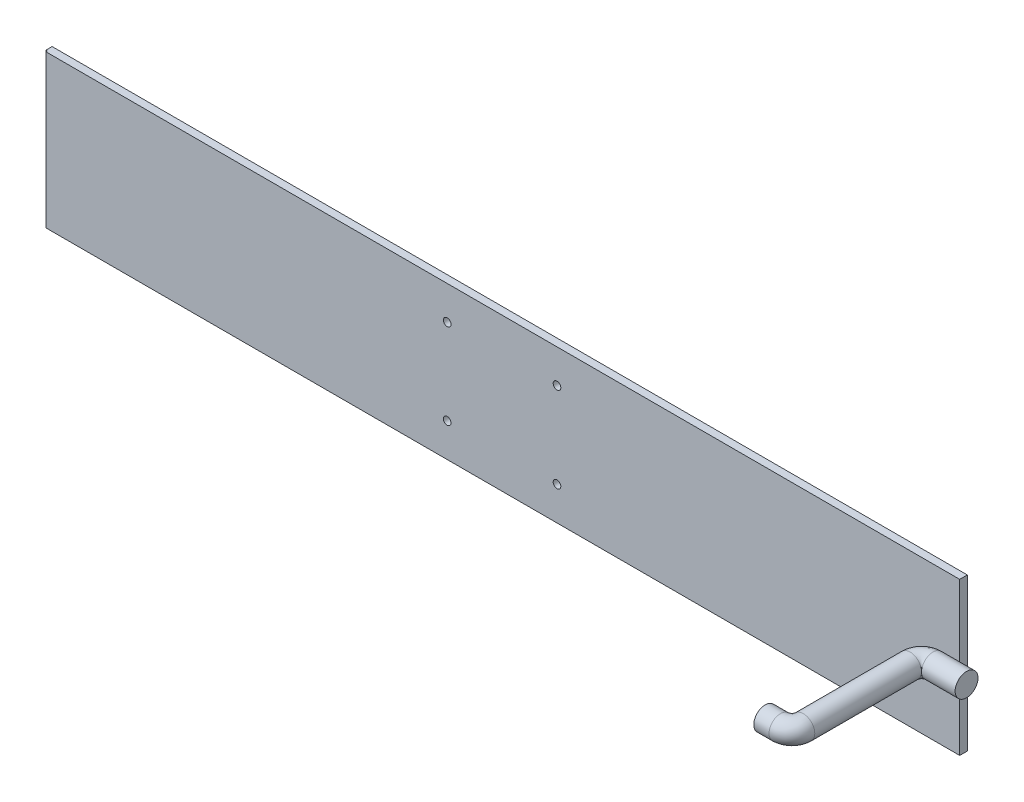
ISO-10303-21;
HEADER;
FILE_DESCRIPTION(('STEP AP214'),'2;1');
FILE_NAME('part.step','',(''),(''),'','','');
FILE_SCHEMA(('AUTOMOTIVE_DESIGN { 1 0 10303 214 1 1 1 1 }'));
ENDSEC;
DATA;
#1=APPLICATION_CONTEXT('core data for automotive mechanical design processes');
#2=APPLICATION_PROTOCOL_DEFINITION('international standard','automotive_design',2000,#1);
#3=PRODUCT_CONTEXT('',#1,'mechanical');
#4=PRODUCT('Part','Part','',(#3));
#5=PRODUCT_RELATED_PRODUCT_CATEGORY('part','',(#4));
#6=PRODUCT_DEFINITION_FORMATION('','',#4);
#7=PRODUCT_DEFINITION_CONTEXT('part definition',#1,'design');
#8=PRODUCT_DEFINITION('design','',#6,#7);
#9=PRODUCT_DEFINITION_SHAPE('','',#8);
#10=(LENGTH_UNIT() NAMED_UNIT(*) SI_UNIT(.MILLI.,.METRE.));
#11=(NAMED_UNIT(*) PLANE_ANGLE_UNIT() SI_UNIT($,.RADIAN.));
#12=(NAMED_UNIT(*) SI_UNIT($,.STERADIAN.) SOLID_ANGLE_UNIT());
#13=UNCERTAINTY_MEASURE_WITH_UNIT(LENGTH_MEASURE(1.E-05),#10,'distance_accuracy_value','');
#14=(GEOMETRIC_REPRESENTATION_CONTEXT(3) GLOBAL_UNCERTAINTY_ASSIGNED_CONTEXT((#13)) GLOBAL_UNIT_ASSIGNED_CONTEXT((#10,
#11,#12)) REPRESENTATION_CONTEXT('',''));
#15=CARTESIAN_POINT('',(0.,0.,0.));
#16=DIRECTION('',(0.,0.,1.));
#17=DIRECTION('',(1.,0.,0.));
#18=AXIS2_PLACEMENT_3D('',#15,#16,#17);
#19=CARTESIAN_POINT('',(612.000000000004,-50.0000000000011,12.5));
#20=DIRECTION('',(-1.00000000000001,0.,0.));
#21=DIRECTION('',(0.,0.,1.));
#22=AXIS2_PLACEMENT_3D('',#19,#20,#21);
#23=CYLINDRICAL_SURFACE('',#22,7.5);
#24=CARTESIAN_POINT('',(612.000000000004,-50.0000000000011,12.5));
#25=DIRECTION('',(1.00000000000001,0.,0.));
#26=DIRECTION('',(0.,0.,-1.));
#27=AXIS2_PLACEMENT_3D('',#24,#25,#26);
#28=CIRCLE('',#27,7.5);
#29=CARTESIAN_POINT('',(612.000000000004,-50.0000000000011,4.99999999999995));
#30=VERTEX_POINT('',#29);
#31=EDGE_CURVE('E13',#30,#30,#28,.T.);
#32=ORIENTED_EDGE('',*,*,#31,.F.);
#33=EDGE_LOOP('',(#32));
#34=FACE_BOUND('',#33,.T.);
#35=CARTESIAN_POINT('',(590.000000000004,-50.0000000000011,12.4999999999978));
#36=DIRECTION('',(-1.00000000000001,0.,0.));
#37=DIRECTION('',(0.,0.,1.));
#38=AXIS2_PLACEMENT_3D('',#35,#36,#37);
#39=CIRCLE('',#38,7.5);
#40=CARTESIAN_POINT('',(590.,-50.0000000000012,19.9999999999978));
#41=VERTEX_POINT('',#40);
#42=EDGE_CURVE('E84',#41,#41,#39,.T.);
#43=ORIENTED_EDGE('',*,*,#42,.F.);
#44=EDGE_LOOP('',(#43));
#45=FACE_BOUND('',#44,.T.);
#46=ADVANCED_FACE('F71',(#34,#45),#23,.T.);
#47=CARTESIAN_POINT('',(612.000000000004,-50.0000000000011,12.5));
#48=DIRECTION('',(1.00000000000001,0.,0.));
#49=DIRECTION('',(0.,0.,-1.));
#50=AXIS2_PLACEMENT_3D('',#47,#48,#49);
#51=PLANE('',#50);
#52=ORIENTED_EDGE('',*,*,#31,.T.);
#53=EDGE_LOOP('',(#52));
#54=FACE_BOUND('',#53,.T.);
#55=ADVANCED_FACE('F117',(#54),#51,.T.);
#56=CARTESIAN_POINT('',(565.000000000005,-50.0000000000011,97.4999999999999));
#57=DIRECTION('',(-1.00000000000001,0.,0.));
#58=DIRECTION('',(0.,0.,1.));
#59=AXIS2_PLACEMENT_3D('',#56,#57,#58);
#60=PLANE('',#59);
#61=CARTESIAN_POINT('',(565.000000000005,-50.0000000000011,97.4999999999999));
#62=DIRECTION('',(-1.00000000000001,0.,0.));
#63=DIRECTION('',(0.,0.,1.));
#64=AXIS2_PLACEMENT_3D('',#61,#62,#63);
#65=CIRCLE('',#64,7.5);
#66=CARTESIAN_POINT('',(565.000000000005,-50.0000000000011,105.));
#67=VERTEX_POINT('',#66);
#68=EDGE_CURVE('E79',#67,#67,#65,.T.);
#69=ORIENTED_EDGE('',*,*,#68,.T.);
#70=EDGE_LOOP('',(#69));
#71=FACE_BOUND('',#70,.T.);
#72=ADVANCED_FACE('F110',(#71),#60,.T.);
#73=CARTESIAN_POINT('',(590.,-50.0000000000012,27.4999999999978));
#74=DIRECTION('',(-1.00000000000001,0.,0.));
#75=DIRECTION('',(0.,0.,1.));
#76=AXIS2_PLACEMENT_3D('',#73,#74,#75);
#77=CIRCLE('',#76,7.5);
#78=TRIMMED_CURVE('',#77,(PARAMETER_VALUE(-3.14159257334458)),
(PARAMETER_VALUE(3.14159257334458)),.T.,.PARAMETER.);
#79=CARTESIAN_POINT('',(590.,-50.0000000000012,19.9999999999978));
#80=DIRECTION('',(0.,1.00000000000001,0.));
#81=AXIS1_PLACEMENT('',#79,#80);
#82=SURFACE_OF_REVOLUTION('',#78,#81);
#83=CARTESIAN_POINT('',(582.5,-50.0000000000011,20.));
#84=DIRECTION('',(0.,0.,1.));
#85=DIRECTION('',(1.00000000000001,0.,0.));
#86=AXIS2_PLACEMENT_3D('',#83,#84,#85);
#87=CIRCLE('',#86,7.5);
#88=EDGE_CURVE('E96',#41,#41,#87,.T.);
#89=ORIENTED_EDGE('',*,*,#88,.F.);
#90=ORIENTED_EDGE('',*,*,#42,.T.);
#91=EDGE_LOOP('',(#89,#90));
#92=FACE_BOUND('',#91,.T.);
#93=ADVANCED_FACE('F123',(#92),#82,.T.);
#94=CARTESIAN_POINT('',(582.5,-50.0000000000011,20.));
#95=DIRECTION('',(0.,0.,1.));
#96=DIRECTION('',(1.00000000000001,0.,0.));
#97=AXIS2_PLACEMENT_3D('',#94,#95,#96);
#98=CYLINDRICAL_SURFACE('',#97,7.5);
#99=CARTESIAN_POINT('',(582.500000000004,-50.0000000000011,90.));
#100=DIRECTION('',(0.,0.,1.));
#101=DIRECTION('',(1.00000000000001,0.,0.));
#102=AXIS2_PLACEMENT_3D('',#99,#100,#101);
#103=CIRCLE('',#102,7.5);
#104=CARTESIAN_POINT('',(575.000000000004,-50.,90.));
#105=VERTEX_POINT('',#104);
#106=EDGE_CURVE('E88',#105,#105,#103,.T.);
#107=ORIENTED_EDGE('',*,*,#106,.F.);
#108=EDGE_LOOP('',(#107));
#109=FACE_BOUND('',#108,.T.);
#110=ORIENTED_EDGE('',*,*,#88,.T.);
#111=EDGE_LOOP('',(#110));
#112=FACE_BOUND('',#111,.T.);
#113=ADVANCED_FACE('F89',(#109,#112),#98,.T.);
#114=CARTESIAN_POINT('',(575.000000000004,-50.,82.5));
#115=DIRECTION('',(-1.00000000000001,0.,0.));
#116=DIRECTION('',(0.,0.,-1.));
#117=AXIS2_PLACEMENT_3D('',#114,#115,#116);
#118=CIRCLE('',#117,7.5);
#119=TRIMMED_CURVE('',#118,(PARAMETER_VALUE(-3.14159254010593)),
(PARAMETER_VALUE(3.14159254010593)),.T.,.PARAMETER.);
#120=CARTESIAN_POINT('',(575.000000000004,-50.,90.));
#121=DIRECTION('',(0.,-1.00000000000001,0.));
#122=AXIS1_PLACEMENT('',#120,#121);
#123=SURFACE_OF_REVOLUTION('',#119,#122);
#124=CARTESIAN_POINT('',(575.000000000005,-50.0000000000011,97.4999999999999));
#125=DIRECTION('',(-1.00000000000001,0.,0.));
#126=DIRECTION('',(0.,0.,1.));
#127=AXIS2_PLACEMENT_3D('',#124,#125,#126);
#128=CIRCLE('',#127,7.5);
#129=EDGE_CURVE('E95',#105,#105,#128,.T.);
#130=ORIENTED_EDGE('',*,*,#129,.F.);
#131=ORIENTED_EDGE('',*,*,#106,.T.);
#132=EDGE_LOOP('',(#130,#131));
#133=FACE_BOUND('',#132,.T.);
#134=ADVANCED_FACE('F115',(#133),#123,.T.);
#135=CARTESIAN_POINT('',(575.000000000005,-50.0000000000011,97.4999999999999));
#136=DIRECTION('',(-1.00000000000001,0.,0.));
#137=DIRECTION('',(0.,0.,1.));
#138=AXIS2_PLACEMENT_3D('',#135,#136,#137);
#139=CYLINDRICAL_SURFACE('',#138,7.5);
#140=ORIENTED_EDGE('',*,*,#68,.F.);
#141=EDGE_LOOP('',(#140));
#142=FACE_BOUND('',#141,.T.);
#143=ORIENTED_EDGE('',*,*,#129,.T.);
#144=EDGE_LOOP('',(#143));
#145=FACE_BOUND('',#144,.T.);
#146=ADVANCED_FACE('F112',(#142,#145),#139,.T.);
#147=CLOSED_SHELL('',(#46,#55,#72,#93,#113,#134,#146));
#148=MANIFOLD_SOLID_BREP('B2',#147);
#149=CARTESIAN_POINT('',(0.,0.,5.));
#150=DIRECTION('',(1.00000000000001,0.,0.));
#151=DIRECTION('',(0.,1.00000000000001,0.));
#152=AXIS2_PLACEMENT_3D('',#149,#150,#151);
#153=PLANE('',#152);
#154=DIRECTION('',(0.,1.00000000000001,0.));
#155=VECTOR('',#154,1.);
#156=CARTESIAN_POINT('',(1.11022302462516E-12,-50.,0.499999999999945));
#157=LINE('',#156,#155);
#158=CARTESIAN_POINT('',(1.11022302462516E-12,-60.,0.500000000000056));
#159=VERTEX_POINT('',#158);
#160=CARTESIAN_POINT('',(1.11022302462516E-12,-40.,0.499999999999945));
#161=VERTEX_POINT('',#160);
#162=EDGE_CURVE('E310',#159,#161,#157,.T.);
#163=ORIENTED_EDGE('',*,*,#162,.F.);
#164=DIRECTION('',(0.,0.,-1.));
#165=VECTOR('',#164,1.);
#166=CARTESIAN_POINT('',(1.11022302462516E-12,-60.,0.500000000000056));
#167=LINE('',#166,#165);
#168=CARTESIAN_POINT('',(1.0547118733939E-12,-60.,0.));
#169=VERTEX_POINT('',#168);
#170=EDGE_CURVE('E345',#159,#169,#167,.T.);
#171=ORIENTED_EDGE('',*,*,#170,.T.);
#172=DIRECTION('',(0.,-1.00000000000001,0.));
#173=VECTOR('',#172,1.);
#174=CARTESIAN_POINT('',(0.,0.,0.));
#175=LINE('',#174,#173);
#176=CARTESIAN_POINT('',(0.,-100.000000000001,0.));
#177=VERTEX_POINT('',#176);
#178=EDGE_CURVE('E392',#169,#177,#175,.T.);
#179=ORIENTED_EDGE('',*,*,#178,.T.);
#180=DIRECTION('',(0.,0.,-1.));
#181=VECTOR('',#180,1.);
#182=CARTESIAN_POINT('',(0.,-100.000000000001,5.));
#183=LINE('',#182,#181);
#184=CARTESIAN_POINT('',(1.11022302462516E-12,-100.000000000001,4.));
#185=VERTEX_POINT('',#184);
#186=EDGE_CURVE('E69',#185,#177,#183,.T.);
#187=ORIENTED_EDGE('',*,*,#186,.F.);
#188=DIRECTION('',(0.,-1.00000000000001,0.));
#189=VECTOR('',#188,1.);
#190=CARTESIAN_POINT('',(0.,0.,4.));
#191=LINE('',#190,#189);
#192=CARTESIAN_POINT('',(0.,0.,4.));
#193=VERTEX_POINT('',#192);
#194=EDGE_CURVE('E373',#193,#185,#191,.T.);
#195=ORIENTED_EDGE('',*,*,#194,.F.);
#196=DIRECTION('',(0.,0.,-1.));
#197=VECTOR('',#196,1.);
#198=CARTESIAN_POINT('',(0.,0.,5.));
#199=LINE('',#198,#197);
#200=CARTESIAN_POINT('',(0.,0.,0.));
#201=VERTEX_POINT('',#200);
#202=EDGE_CURVE('E406',#193,#201,#199,.T.);
#203=ORIENTED_EDGE('',*,*,#202,.T.);
#204=CARTESIAN_POINT('',(1.11022302462516E-12,-40.,0.));
#205=VERTEX_POINT('',#204);
#206=EDGE_CURVE('E329',#201,#205,#175,.T.);
#207=ORIENTED_EDGE('',*,*,#206,.T.);
#208=DIRECTION('',(0.,0.,-1.));
#209=VECTOR('',#208,1.);
#210=CARTESIAN_POINT('',(1.11022302462516E-12,-40.,0.499999999999945));
#211=LINE('',#210,#209);
#212=EDGE_CURVE('E244',#161,#205,#211,.T.);
#213=ORIENTED_EDGE('',*,*,#212,.F.);
#214=EDGE_LOOP('',(#163,#171,#179,#187,#195,#203,#207,#213));
#215=FACE_BOUND('',#214,.T.);
#216=ADVANCED_FACE('F229',(#215),#153,.F.);
#217=CARTESIAN_POINT('',(0.,-100.000000000001,5.));
#218=DIRECTION('',(0.,1.00000000000001,0.));
#219=DIRECTION('',(0.,0.,1.));
#220=AXIS2_PLACEMENT_3D('',#217,#218,#219);
#221=PLANE('',#220);
#222=DIRECTION('',(0.,0.,1.));
#223=VECTOR('',#222,1.);
#224=CARTESIAN_POINT('',(1.00000000000111,-100.000000000001,4.));
#225=LINE('',#224,#223);
#226=CARTESIAN_POINT('',(1.00000000000111,-100.000000000001,4.));
#227=VERTEX_POINT('',#226);
#228=CARTESIAN_POINT('',(1.,-100.000000000001,4.99999999999989));
#229=VERTEX_POINT('',#228);
#230=EDGE_CURVE('E252',#227,#229,#225,.T.);
#231=ORIENTED_EDGE('',*,*,#230,.F.);
#232=DIRECTION('',(-1.00000000000001,0.,0.));
#233=VECTOR('',#232,1.);
#234=CARTESIAN_POINT('',(1.00000000000111,-100.000000000001,4.));
#235=LINE('',#234,#233);
#236=EDGE_CURVE('E388',#227,#185,#235,.T.);
#237=ORIENTED_EDGE('',*,*,#236,.T.);
#238=ORIENTED_EDGE('',*,*,#186,.T.);
#239=DIRECTION('',(1.00000000000001,0.,0.));
#240=VECTOR('',#239,1.);
#241=CARTESIAN_POINT('',(0.,-100.000000000001,0.));
#242=LINE('',#241,#240);
#243=CARTESIAN_POINT('',(600.000000000005,-100.000000000001,0.));
#244=VERTEX_POINT('',#243);
#245=EDGE_CURVE('E409',#177,#244,#242,.T.);
#246=ORIENTED_EDGE('',*,*,#245,.T.);
#247=DIRECTION('',(0.,0.,-1.));
#248=VECTOR('',#247,1.);
#249=CARTESIAN_POINT('',(600.000000000009,-100.000000000001,4.99999999999989));
#250=LINE('',#249,#248);
#251=CARTESIAN_POINT('',(600.000000000009,-100.000000000001,4.99999999999989));
#252=VERTEX_POINT('',#251);
#253=EDGE_CURVE('E237',#252,#244,#250,.T.);
#254=ORIENTED_EDGE('',*,*,#253,.F.);
#255=DIRECTION('',(1.00000000000001,0.,0.));
#256=VECTOR('',#255,1.);
#257=CARTESIAN_POINT('',(0.,-100.000000000001,5.));
#258=LINE('',#257,#256);
#259=EDGE_CURVE('E395',#229,#252,#258,.T.);
#260=ORIENTED_EDGE('',*,*,#259,.F.);
#261=EDGE_LOOP('',(#231,#237,#238,#246,#254,#260));
#262=FACE_BOUND('',#261,.T.);
#263=ADVANCED_FACE('F447',(#262),#221,.F.);
#264=CARTESIAN_POINT('',(600.000000000005,0.,5.));
#265=DIRECTION('',(-1.00000000000001,0.,0.));
#266=DIRECTION('',(0.,0.,1.));
#267=AXIS2_PLACEMENT_3D('',#264,#265,#266);
#268=PLANE('',#267);
#269=DIRECTION('',(0.,1.00000000000001,0.));
#270=VECTOR('',#269,1.);
#271=CARTESIAN_POINT('',(600.000000000004,0.,0.));
#272=LINE('',#271,#270);
#273=CARTESIAN_POINT('',(600.000000000004,0.,0.));
#274=VERTEX_POINT('',#273);
#275=EDGE_CURVE('E412',#244,#274,#272,.T.);
#276=ORIENTED_EDGE('',*,*,#275,.T.);
#277=DIRECTION('',(0.,0.,-1.));
#278=VECTOR('',#277,1.);
#279=CARTESIAN_POINT('',(600.000000000005,0.,5.));
#280=LINE('',#279,#278);
#281=CARTESIAN_POINT('',(600.000000000005,0.,5.));
#282=VERTEX_POINT('',#281);
#283=EDGE_CURVE('E420',#282,#274,#280,.T.);
#284=ORIENTED_EDGE('',*,*,#283,.F.);
#285=DIRECTION('',(0.,1.00000000000001,0.));
#286=VECTOR('',#285,1.);
#287=CARTESIAN_POINT('',(600.000000000005,0.,5.));
#288=LINE('',#287,#286);
#289=EDGE_CURVE('E398',#252,#282,#288,.T.);
#290=ORIENTED_EDGE('',*,*,#289,.F.);
#291=ORIENTED_EDGE('',*,*,#253,.T.);
#292=EDGE_LOOP('',(#276,#284,#290,#291));
#293=FACE_BOUND('',#292,.T.);
#294=ADVANCED_FACE('F430',(#293),#268,.F.);
#295=CARTESIAN_POINT('',(0.,0.,5.));
#296=DIRECTION('',(0.,-1.00000000000001,0.));
#297=DIRECTION('',(0.,0.,-1.));
#298=AXIS2_PLACEMENT_3D('',#295,#296,#297);
#299=PLANE('',#298);
#300=ORIENTED_EDGE('',*,*,#202,.F.);
#301=DIRECTION('',(-1.00000000000001,0.,0.));
#302=VECTOR('',#301,1.);
#303=CARTESIAN_POINT('',(1.,0.,4.));
#304=LINE('',#303,#302);
#305=CARTESIAN_POINT('',(1.,0.,4.));
#306=VERTEX_POINT('',#305);
#307=EDGE_CURVE('E385',#306,#193,#304,.T.);
#308=ORIENTED_EDGE('',*,*,#307,.F.);
#309=DIRECTION('',(0.,0.,-1.));
#310=VECTOR('',#309,1.);
#311=CARTESIAN_POINT('',(1.,0.,5.));
#312=LINE('',#311,#310);
#313=CARTESIAN_POINT('',(1.,0.,5.));
#314=VERTEX_POINT('',#313);
#315=EDGE_CURVE('E379',#314,#306,#312,.T.);
#316=ORIENTED_EDGE('',*,*,#315,.F.);
#317=DIRECTION('',(-1.00000000000001,0.,0.));
#318=VECTOR('',#317,1.);
#319=CARTESIAN_POINT('',(0.,0.,5.));
#320=LINE('',#319,#318);
#321=EDGE_CURVE('E402',#282,#314,#320,.T.);
#322=ORIENTED_EDGE('',*,*,#321,.F.);
#323=ORIENTED_EDGE('',*,*,#283,.T.);
#324=DIRECTION('',(-1.00000000000001,0.,0.));
#325=VECTOR('',#324,1.);
#326=CARTESIAN_POINT('',(0.,0.,0.));
#327=LINE('',#326,#325);
#328=EDGE_CURVE('E399',#274,#201,#327,.T.);
#329=ORIENTED_EDGE('',*,*,#328,.T.);
#330=EDGE_LOOP('',(#300,#308,#316,#322,#323,#329));
#331=FACE_BOUND('',#330,.T.);
#332=ADVANCED_FACE('F441',(#331),#299,.F.);
#333=CARTESIAN_POINT('',(0.,0.,5.));
#334=DIRECTION('',(0.,0.,1.));
#335=DIRECTION('',(1.00000000000001,0.,0.));
#336=AXIS2_PLACEMENT_3D('',#333,#334,#335);
#337=PLANE('',#336);
#338=CARTESIAN_POINT('',(336.000000000004,-22.0000000000001,5.));
#339=DIRECTION('',(0.,0.,1.));
#340=DIRECTION('',(1.00000000000001,0.,0.));
#341=AXIS2_PLACEMENT_3D('',#338,#339,#340);
#342=CIRCLE('',#341,2.5);
#343=CARTESIAN_POINT('',(338.500000000004,-22.0000000000001,5.));
#344=VERTEX_POINT('',#343);
#345=EDGE_CURVE('E344',#344,#344,#342,.T.);
#346=ORIENTED_EDGE('',*,*,#345,.F.);
#347=EDGE_LOOP('',(#346));
#348=FACE_BOUND('',#347,.T.);
#349=CARTESIAN_POINT('',(264.000000000002,-22.0000000000001,5.));
#350=DIRECTION('',(0.,0.,1.));
#351=DIRECTION('',(1.00000000000001,0.,0.));
#352=AXIS2_PLACEMENT_3D('',#349,#350,#351);
#353=CIRCLE('',#352,2.5);
#354=CARTESIAN_POINT('',(266.500000000002,-22.0000000000001,5.));
#355=VERTEX_POINT('',#354);
#356=EDGE_CURVE('E353',#355,#355,#353,.T.);
#357=ORIENTED_EDGE('',*,*,#356,.F.);
#358=EDGE_LOOP('',(#357));
#359=FACE_BOUND('',#358,.T.);
#360=CARTESIAN_POINT('',(336.000000000004,-78.0000000000012,5.));
#361=DIRECTION('',(0.,0.,1.));
#362=DIRECTION('',(1.00000000000001,0.,0.));
#363=AXIS2_PLACEMENT_3D('',#360,#361,#362);
#364=CIRCLE('',#363,2.5);
#365=CARTESIAN_POINT('',(338.500000000004,-78.0000000000012,5.));
#366=VERTEX_POINT('',#365);
#367=EDGE_CURVE('E361',#366,#366,#364,.T.);
#368=ORIENTED_EDGE('',*,*,#367,.F.);
#369=EDGE_LOOP('',(#368));
#370=FACE_BOUND('',#369,.T.);
#371=CARTESIAN_POINT('',(264.,-78.0000000000012,5.));
#372=DIRECTION('',(0.,0.,1.));
#373=DIRECTION('',(1.00000000000001,0.,0.));
#374=AXIS2_PLACEMENT_3D('',#371,#372,#373);
#375=CIRCLE('',#374,2.5);
#376=CARTESIAN_POINT('',(266.5,-78.0000000000012,5.));
#377=VERTEX_POINT('',#376);
#378=EDGE_CURVE('E369',#377,#377,#375,.T.);
#379=ORIENTED_EDGE('',*,*,#378,.F.);
#380=EDGE_LOOP('',(#379));
#381=FACE_BOUND('',#380,.T.);
#382=DIRECTION('',(0.,1.00000000000001,0.));
#383=VECTOR('',#382,1.);
#384=CARTESIAN_POINT('',(1.00000000000006,-50.,5.));
#385=LINE('',#384,#383);
#386=EDGE_CURVE('E376',#229,#314,#385,.T.);
#387=ORIENTED_EDGE('',*,*,#386,.F.);
#388=ORIENTED_EDGE('',*,*,#259,.T.);
#389=ORIENTED_EDGE('',*,*,#289,.T.);
#390=ORIENTED_EDGE('',*,*,#321,.T.);
#391=EDGE_LOOP('',(#387,#388,#389,#390));
#392=FACE_BOUND('',#391,.T.);
#393=ADVANCED_FACE('F446',(#348,#359,#370,#381,#392),#337,.T.);
#394=CARTESIAN_POINT('',(0.,0.,0.));
#395=DIRECTION('',(0.,0.,1.));
#396=DIRECTION('',(1.00000000000001,0.,0.));
#397=AXIS2_PLACEMENT_3D('',#394,#395,#396);
#398=PLANE('',#397);
#399=CARTESIAN_POINT('',(336.000000000004,-22.0000000000001,0.));
#400=DIRECTION('',(0.,0.,-1.));
#401=DIRECTION('',(-1.00000000000001,0.,0.));
#402=AXIS2_PLACEMENT_3D('',#399,#400,#401);
#403=CIRCLE('',#402,2.5);
#404=CARTESIAN_POINT('',(333.500000000004,-22.0000000000001,0.));
#405=VERTEX_POINT('',#404);
#406=EDGE_CURVE('E340',#405,#405,#403,.T.);
#407=ORIENTED_EDGE('',*,*,#406,.F.);
#408=EDGE_LOOP('',(#407));
#409=FACE_BOUND('',#408,.T.);
#410=CARTESIAN_POINT('',(264.000000000002,-22.0000000000001,0.));
#411=DIRECTION('',(0.,0.,-1.));
#412=DIRECTION('',(-1.00000000000001,0.,0.));
#413=AXIS2_PLACEMENT_3D('',#410,#411,#412);
#414=CIRCLE('',#413,2.5);
#415=CARTESIAN_POINT('',(261.500000000002,-22.0000000000001,0.));
#416=VERTEX_POINT('',#415);
#417=EDGE_CURVE('E349',#416,#416,#414,.T.);
#418=ORIENTED_EDGE('',*,*,#417,.F.);
#419=EDGE_LOOP('',(#418));
#420=FACE_BOUND('',#419,.T.);
#421=CARTESIAN_POINT('',(336.000000000004,-78.0000000000012,0.));
#422=DIRECTION('',(0.,0.,-1.));
#423=DIRECTION('',(-1.00000000000001,0.,0.));
#424=AXIS2_PLACEMENT_3D('',#421,#422,#423);
#425=CIRCLE('',#424,2.5);
#426=CARTESIAN_POINT('',(333.500000000004,-78.0000000000012,0.));
#427=VERTEX_POINT('',#426);
#428=EDGE_CURVE('E357',#427,#427,#425,.T.);
#429=ORIENTED_EDGE('',*,*,#428,.F.);
#430=EDGE_LOOP('',(#429));
#431=FACE_BOUND('',#430,.T.);
#432=CARTESIAN_POINT('',(264.,-78.0000000000007,0.));
#433=DIRECTION('',(0.,0.,-1.));
#434=DIRECTION('',(-1.00000000000001,0.,0.));
#435=AXIS2_PLACEMENT_3D('',#432,#433,#434);
#436=CIRCLE('',#435,2.5);
#437=CARTESIAN_POINT('',(261.5,-78.0000000000007,0.));
#438=VERTEX_POINT('',#437);
#439=EDGE_CURVE('E365',#438,#438,#436,.T.);
#440=ORIENTED_EDGE('',*,*,#439,.F.);
#441=EDGE_LOOP('',(#440));
#442=FACE_BOUND('',#441,.T.);
#443=ORIENTED_EDGE('',*,*,#178,.F.);
#444=DIRECTION('',(-1.00000000000001,0.,0.));
#445=VECTOR('',#444,1.);
#446=CARTESIAN_POINT('',(1.0547118733939E-12,-60.,0.));
#447=LINE('',#446,#445);
#448=CARTESIAN_POINT('',(40.,-60.0000000000001,0.));
#449=VERTEX_POINT('',#448);
#450=EDGE_CURVE('E319',#449,#169,#447,.T.);
#451=ORIENTED_EDGE('',*,*,#450,.F.);
#452=DIRECTION('',(0.,-1.00000000000001,0.));
#453=VECTOR('',#452,1.);
#454=CARTESIAN_POINT('',(40.,-40.,0.));
#455=LINE('',#454,#453);
#456=CARTESIAN_POINT('',(40.,-40.,0.));
#457=VERTEX_POINT('',#456);
#458=EDGE_CURVE('E482',#457,#449,#455,.T.);
#459=ORIENTED_EDGE('',*,*,#458,.F.);
#460=DIRECTION('',(1.00000000000001,0.,0.));
#461=VECTOR('',#460,1.);
#462=CARTESIAN_POINT('',(1.11022302462516E-12,-40.,0.));
#463=LINE('',#462,#461);
#464=EDGE_CURVE('E485',#205,#457,#463,.T.);
#465=ORIENTED_EDGE('',*,*,#464,.F.);
#466=ORIENTED_EDGE('',*,*,#206,.F.);
#467=ORIENTED_EDGE('',*,*,#328,.F.);
#468=ORIENTED_EDGE('',*,*,#275,.F.);
#469=ORIENTED_EDGE('',*,*,#245,.F.);
#470=EDGE_LOOP('',(#443,#451,#459,#465,#466,#467,#468,#469));
#471=FACE_BOUND('',#470,.T.);
#472=ADVANCED_FACE('F438',(#409,#420,#431,#442,#471),#398,.F.);
#473=CARTESIAN_POINT('',(1.,0.,4.));
#474=DIRECTION('',(0.,0.,-1.));
#475=DIRECTION('',(0.,1.00000000000001,0.));
#476=AXIS2_PLACEMENT_3D('',#473,#474,#475);
#477=PLANE('',#476);
#478=ORIENTED_EDGE('',*,*,#194,.T.);
#479=ORIENTED_EDGE('',*,*,#236,.F.);
#480=DIRECTION('',(0.,-1.00000000000001,0.));
#481=VECTOR('',#480,1.);
#482=CARTESIAN_POINT('',(1.,0.,4.));
#483=LINE('',#482,#481);
#484=EDGE_CURVE('E382',#306,#227,#483,.T.);
#485=ORIENTED_EDGE('',*,*,#484,.F.);
#486=ORIENTED_EDGE('',*,*,#307,.T.);
#487=EDGE_LOOP('',(#478,#479,#485,#486));
#488=FACE_BOUND('',#487,.T.);
#489=ADVANCED_FACE('F519',(#488),#477,.F.);
#490=CARTESIAN_POINT('',(1.,0.,0.));
#491=DIRECTION('',(1.00000000000001,0.,0.));
#492=DIRECTION('',(0.,1.00000000000001,0.));
#493=AXIS2_PLACEMENT_3D('',#490,#491,#492);
#494=PLANE('',#493);
#495=ORIENTED_EDGE('',*,*,#230,.T.);
#496=ORIENTED_EDGE('',*,*,#386,.T.);
#497=ORIENTED_EDGE('',*,*,#315,.T.);
#498=ORIENTED_EDGE('',*,*,#484,.T.);
#499=EDGE_LOOP('',(#495,#496,#497,#498));
#500=FACE_BOUND('',#499,.T.);
#501=ADVANCED_FACE('F526',(#500),#494,.F.);
#502=CARTESIAN_POINT('',(264.,-78.0000000000007,0.));
#503=DIRECTION('',(0.,0.,-1.));
#504=DIRECTION('',(-1.00000000000001,0.,0.));
#505=AXIS2_PLACEMENT_3D('',#502,#503,#504);
#506=CYLINDRICAL_SURFACE('',#505,2.5);
#507=ORIENTED_EDGE('',*,*,#378,.T.);
#508=EDGE_LOOP('',(#507));
#509=FACE_BOUND('',#508,.T.);
#510=ORIENTED_EDGE('',*,*,#439,.T.);
#511=EDGE_LOOP('',(#510));
#512=FACE_BOUND('',#511,.T.);
#513=ADVANCED_FACE('F529',(#509,#512),#506,.F.);
#514=CARTESIAN_POINT('',(336.000000000004,-78.0000000000012,0.));
#515=DIRECTION('',(0.,0.,-1.));
#516=DIRECTION('',(-1.00000000000001,0.,0.));
#517=AXIS2_PLACEMENT_3D('',#514,#515,#516);
#518=CYLINDRICAL_SURFACE('',#517,2.5);
#519=ORIENTED_EDGE('',*,*,#367,.T.);
#520=EDGE_LOOP('',(#519));
#521=FACE_BOUND('',#520,.T.);
#522=ORIENTED_EDGE('',*,*,#428,.T.);
#523=EDGE_LOOP('',(#522));
#524=FACE_BOUND('',#523,.T.);
#525=ADVANCED_FACE('F532',(#521,#524),#518,.F.);
#526=CARTESIAN_POINT('',(264.000000000002,-22.0000000000001,0.));
#527=DIRECTION('',(0.,0.,-1.));
#528=DIRECTION('',(-1.00000000000001,0.,0.));
#529=AXIS2_PLACEMENT_3D('',#526,#527,#528);
#530=CYLINDRICAL_SURFACE('',#529,2.5);
#531=ORIENTED_EDGE('',*,*,#356,.T.);
#532=EDGE_LOOP('',(#531));
#533=FACE_BOUND('',#532,.T.);
#534=ORIENTED_EDGE('',*,*,#417,.T.);
#535=EDGE_LOOP('',(#534));
#536=FACE_BOUND('',#535,.T.);
#537=ADVANCED_FACE('F536',(#533,#536),#530,.F.);
#538=CARTESIAN_POINT('',(336.000000000004,-22.0000000000001,0.));
#539=DIRECTION('',(0.,0.,-1.));
#540=DIRECTION('',(-1.00000000000001,0.,0.));
#541=AXIS2_PLACEMENT_3D('',#538,#539,#540);
#542=CYLINDRICAL_SURFACE('',#541,2.5);
#543=ORIENTED_EDGE('',*,*,#345,.T.);
#544=EDGE_LOOP('',(#543));
#545=FACE_BOUND('',#544,.T.);
#546=ORIENTED_EDGE('',*,*,#406,.T.);
#547=EDGE_LOOP('',(#546));
#548=FACE_BOUND('',#547,.T.);
#549=ADVANCED_FACE('F502',(#545,#548),#542,.F.);
#550=CARTESIAN_POINT('',(1.11022302462516E-12,-60.,0.500000000000056));
#551=DIRECTION('',(0.,-1.00000000000001,0.));
#552=DIRECTION('',(0.,0.,-1.));
#553=AXIS2_PLACEMENT_3D('',#550,#551,#552);
#554=PLANE('',#553);
#555=ORIENTED_EDGE('',*,*,#450,.T.);
#556=ORIENTED_EDGE('',*,*,#170,.F.);
#557=DIRECTION('',(-1.00000000000001,0.,0.));
#558=VECTOR('',#557,1.);
#559=CARTESIAN_POINT('',(1.11022302462516E-12,-60.,0.500000000000056));
#560=LINE('',#559,#558);
#561=CARTESIAN_POINT('',(40.,-60.0000000000001,0.500000000000056));
#562=VERTEX_POINT('',#561);
#563=EDGE_CURVE('E315',#562,#159,#560,.T.);
#564=ORIENTED_EDGE('',*,*,#563,.F.);
#565=DIRECTION('',(0.,0.,-1.));
#566=VECTOR('',#565,1.);
#567=CARTESIAN_POINT('',(40.,-60.0000000000001,0.500000000000056));
#568=LINE('',#567,#566);
#569=EDGE_CURVE('E335',#562,#449,#568,.T.);
#570=ORIENTED_EDGE('',*,*,#569,.T.);
#571=EDGE_LOOP('',(#555,#556,#564,#570));
#572=FACE_BOUND('',#571,.T.);
#573=ADVANCED_FACE('F491',(#572),#554,.F.);
#574=CARTESIAN_POINT('',(40.,-40.,0.499999999999945));
#575=DIRECTION('',(1.00000000000001,0.,0.));
#576=DIRECTION('',(0.,0.,-1.));
#577=AXIS2_PLACEMENT_3D('',#574,#575,#576);
#578=PLANE('',#577);
#579=ORIENTED_EDGE('',*,*,#458,.T.);
#580=ORIENTED_EDGE('',*,*,#569,.F.);
#581=DIRECTION('',(0.,-1.00000000000001,0.));
#582=VECTOR('',#581,1.);
#583=CARTESIAN_POINT('',(40.,-40.,0.499999999999945));
#584=LINE('',#583,#582);
#585=CARTESIAN_POINT('',(40.,-40.,0.499999999999945));
#586=VERTEX_POINT('',#585);
#587=EDGE_CURVE('E325',#586,#562,#584,.T.);
#588=ORIENTED_EDGE('',*,*,#587,.F.);
#589=DIRECTION('',(0.,0.,-1.));
#590=VECTOR('',#589,1.);
#591=CARTESIAN_POINT('',(40.,-40.,0.499999999999945));
#592=LINE('',#591,#590);
#593=EDGE_CURVE('E322',#586,#457,#592,.T.);
#594=ORIENTED_EDGE('',*,*,#593,.T.);
#595=EDGE_LOOP('',(#579,#580,#588,#594));
#596=FACE_BOUND('',#595,.T.);
#597=ADVANCED_FACE('F493',(#596),#578,.F.);
#598=CARTESIAN_POINT('',(1.11022302462516E-12,-40.,0.499999999999945));
#599=DIRECTION('',(0.,1.00000000000001,0.));
#600=DIRECTION('',(0.,0.,1.));
#601=AXIS2_PLACEMENT_3D('',#598,#599,#600);
#602=PLANE('',#601);
#603=ORIENTED_EDGE('',*,*,#464,.T.);
#604=ORIENTED_EDGE('',*,*,#593,.F.);
#605=DIRECTION('',(1.00000000000001,0.,0.));
#606=VECTOR('',#605,1.);
#607=CARTESIAN_POINT('',(1.11022302462516E-12,-40.,0.499999999999945));
#608=LINE('',#607,#606);
#609=EDGE_CURVE('E313',#161,#586,#608,.T.);
#610=ORIENTED_EDGE('',*,*,#609,.F.);
#611=ORIENTED_EDGE('',*,*,#212,.T.);
#612=EDGE_LOOP('',(#603,#604,#610,#611));
#613=FACE_BOUND('',#612,.T.);
#614=ADVANCED_FACE('F321',(#613),#602,.F.);
#615=CARTESIAN_POINT('',(0.,0.,0.499999999999945));
#616=DIRECTION('',(0.,0.,1.));
#617=DIRECTION('',(1.00000000000001,0.,0.));
#618=AXIS2_PLACEMENT_3D('',#615,#616,#617);
#619=PLANE('',#618);
#620=ORIENTED_EDGE('',*,*,#162,.T.);
#621=ORIENTED_EDGE('',*,*,#609,.T.);
#622=ORIENTED_EDGE('',*,*,#587,.T.);
#623=ORIENTED_EDGE('',*,*,#563,.T.);
#624=EDGE_LOOP('',(#620,#621,#622,#623));
#625=FACE_BOUND('',#624,.T.);
#626=ADVANCED_FACE('F311',(#625),#619,.F.);
#627=CLOSED_SHELL('',(#216,#263,#294,#332,#393,#472,#489,#501,#513,#525,#537,#549,#573,#597,
#614,#626));
#628=MANIFOLD_SOLID_BREP('B7',#627);
#629=ADVANCED_BREP_SHAPE_REPRESENTATION('',(#18,#148,#628),#14);
#630=SHAPE_DEFINITION_REPRESENTATION(#9,#629);
ENDSEC;
END-ISO-10303-21;
